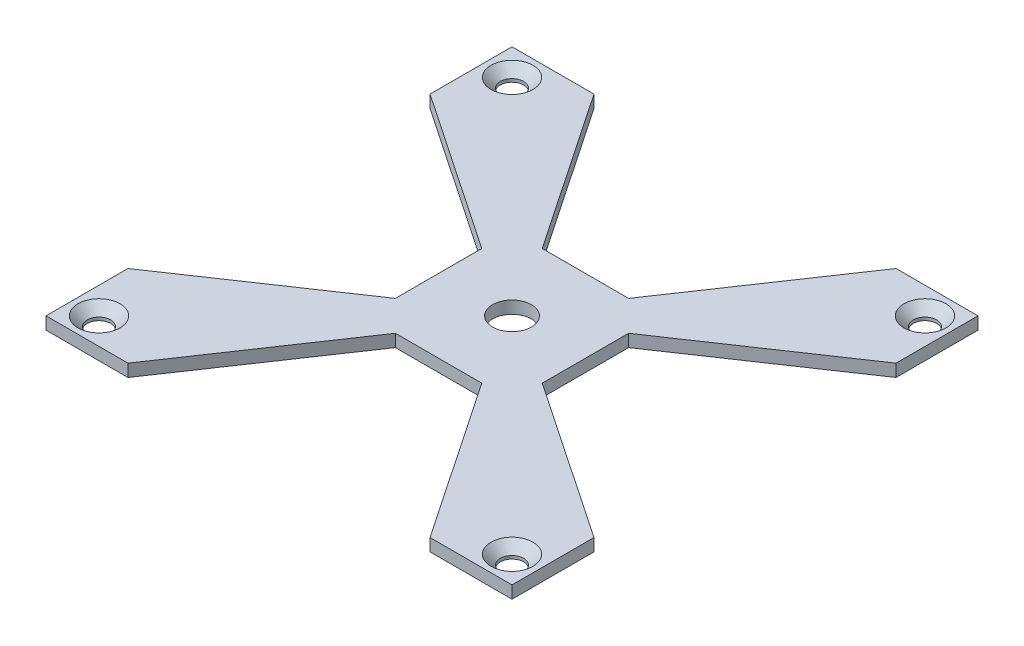
ISO-10303-21;
HEADER;
FILE_DESCRIPTION(('STEP AP214'),'2;1');
FILE_NAME('part.step','',(''),(''),'','','');
FILE_SCHEMA(('AUTOMOTIVE_DESIGN { 1 0 10303 214 1 1 1 1 }'));
ENDSEC;
DATA;
#1=APPLICATION_CONTEXT('core data for automotive mechanical design processes');
#2=APPLICATION_PROTOCOL_DEFINITION('international standard','automotive_design',2000,#1);
#3=PRODUCT_CONTEXT('',#1,'mechanical');
#4=PRODUCT('Part','Part','',(#3));
#5=PRODUCT_RELATED_PRODUCT_CATEGORY('part','',(#4));
#6=PRODUCT_DEFINITION_FORMATION('','',#4);
#7=PRODUCT_DEFINITION_CONTEXT('part definition',#1,'design');
#8=PRODUCT_DEFINITION('design','',#6,#7);
#9=PRODUCT_DEFINITION_SHAPE('','',#8);
#10=(LENGTH_UNIT() NAMED_UNIT(*) SI_UNIT(.MILLI.,.METRE.));
#11=(NAMED_UNIT(*) PLANE_ANGLE_UNIT() SI_UNIT($,.RADIAN.));
#12=(NAMED_UNIT(*) SI_UNIT($,.STERADIAN.) SOLID_ANGLE_UNIT());
#13=UNCERTAINTY_MEASURE_WITH_UNIT(LENGTH_MEASURE(1.E-05),#10,'distance_accuracy_value','');
#14=(GEOMETRIC_REPRESENTATION_CONTEXT(3) GLOBAL_UNCERTAINTY_ASSIGNED_CONTEXT((#13)) GLOBAL_UNIT_ASSIGNED_CONTEXT((#10,
#11,#12)) REPRESENTATION_CONTEXT('',''));
#15=CARTESIAN_POINT('',(0.,0.,0.));
#16=DIRECTION('',(0.,0.,1.));
#17=DIRECTION('',(1.,0.,0.));
#18=AXIS2_PLACEMENT_3D('',#15,#16,#17);
#19=CARTESIAN_POINT('',(47.625,2.54,-47.625));
#20=DIRECTION('',(-1.,0.,0.));
#21=DIRECTION('',(0.,0.,1.));
#22=AXIS2_PLACEMENT_3D('',#19,#20,#21);
#23=PLANE('',#22);
#24=DIRECTION('',(0.,0.,-1.));
#25=VECTOR('',#24,1.);
#26=CARTESIAN_POINT('',(47.625,2.54,-47.625));
#27=LINE('',#26,#25);
#28=CARTESIAN_POINT('',(47.625,2.54,-30.8690323145502));
#29=VERTEX_POINT('',#28);
#30=CARTESIAN_POINT('',(47.625,2.54,-47.625));
#31=VERTEX_POINT('',#30);
#32=EDGE_CURVE('E298',#29,#31,#27,.T.);
#33=ORIENTED_EDGE('',*,*,#32,.F.);
#34=DIRECTION('',(0.,1.,0.));
#35=VECTOR('',#34,1.);
#36=CARTESIAN_POINT('',(47.625,-0.00100000000000013,-30.8690323145502));
#37=LINE('',#36,#35);
#38=CARTESIAN_POINT('',(47.625,0.,-30.8690323145502));
#39=VERTEX_POINT('',#38);
#40=EDGE_CURVE('E220',#39,#29,#37,.T.);
#41=ORIENTED_EDGE('',*,*,#40,.F.);
#42=DIRECTION('',(0.,0.,-1.));
#43=VECTOR('',#42,1.);
#44=CARTESIAN_POINT('',(47.625,0.,-47.625));
#45=LINE('',#44,#43);
#46=CARTESIAN_POINT('',(47.625,0.,-47.625));
#47=VERTEX_POINT('',#46);
#48=EDGE_CURVE('E293',#39,#47,#45,.T.);
#49=ORIENTED_EDGE('',*,*,#48,.T.);
#50=DIRECTION('',(0.,-1.,0.));
#51=VECTOR('',#50,1.);
#52=CARTESIAN_POINT('',(47.625,2.54,-47.625));
#53=LINE('',#52,#51);
#54=EDGE_CURVE('E333',#31,#47,#53,.T.);
#55=ORIENTED_EDGE('',*,*,#54,.F.);
#56=EDGE_LOOP('',(#33,#41,#49,#55));
#57=FACE_BOUND('',#56,.T.);
#58=ADVANCED_FACE('F39',(#57),#23,.F.);
#59=CARTESIAN_POINT('',(-47.625,2.54,-47.625));
#60=DIRECTION('',(0.,0.,1.));
#61=DIRECTION('',(1.,0.,0.));
#62=AXIS2_PLACEMENT_3D('',#59,#60,#61);
#63=PLANE('',#62);
#64=DIRECTION('',(-1.,0.,0.));
#65=VECTOR('',#64,1.);
#66=CARTESIAN_POINT('',(-47.625,2.54,-47.625));
#67=LINE('',#66,#65);
#68=CARTESIAN_POINT('',(-30.8690323145502,2.54,-47.625));
#69=VERTEX_POINT('',#68);
#70=CARTESIAN_POINT('',(-47.625,2.54,-47.625));
#71=VERTEX_POINT('',#70);
#72=EDGE_CURVE('E297',#69,#71,#67,.T.);
#73=ORIENTED_EDGE('',*,*,#72,.F.);
#74=DIRECTION('',(0.,1.,0.));
#75=VECTOR('',#74,1.);
#76=CARTESIAN_POINT('',(-30.8690323145502,-0.00100000000000013,-47.625));
#77=LINE('',#76,#75);
#78=CARTESIAN_POINT('',(-30.8690323145502,0.,-47.625));
#79=VERTEX_POINT('',#78);
#80=EDGE_CURVE('E243',#79,#69,#77,.T.);
#81=ORIENTED_EDGE('',*,*,#80,.F.);
#82=DIRECTION('',(-1.,0.,0.));
#83=VECTOR('',#82,1.);
#84=CARTESIAN_POINT('',(-47.625,0.,-47.625));
#85=LINE('',#84,#83);
#86=CARTESIAN_POINT('',(-47.625,0.,-47.625));
#87=VERTEX_POINT('',#86);
#88=EDGE_CURVE('E314',#79,#87,#85,.T.);
#89=ORIENTED_EDGE('',*,*,#88,.T.);
#90=DIRECTION('',(0.,-1.,0.));
#91=VECTOR('',#90,1.);
#92=CARTESIAN_POINT('',(-47.625,2.54,-47.625));
#93=LINE('',#92,#91);
#94=EDGE_CURVE('E330',#71,#87,#93,.T.);
#95=ORIENTED_EDGE('',*,*,#94,.F.);
#96=EDGE_LOOP('',(#73,#81,#89,#95));
#97=FACE_BOUND('',#96,.T.);
#98=ADVANCED_FACE('F374',(#97),#63,.F.);
#99=CARTESIAN_POINT('',(-47.625,2.54,-47.625));
#100=DIRECTION('',(1.,0.,0.));
#101=DIRECTION('',(0.,0.,-1.));
#102=AXIS2_PLACEMENT_3D('',#99,#100,#101);
#103=PLANE('',#102);
#104=DIRECTION('',(0.,0.,1.));
#105=VECTOR('',#104,1.);
#106=CARTESIAN_POINT('',(-47.625,2.54,-47.625));
#107=LINE('',#106,#105);
#108=CARTESIAN_POINT('',(-47.625,2.54,30.8690323145502));
#109=VERTEX_POINT('',#108);
#110=CARTESIAN_POINT('',(-47.625,2.54,47.625));
#111=VERTEX_POINT('',#110);
#112=EDGE_CURVE('E302',#109,#111,#107,.T.);
#113=ORIENTED_EDGE('',*,*,#112,.F.);
#114=DIRECTION('',(0.,1.,0.));
#115=VECTOR('',#114,1.);
#116=CARTESIAN_POINT('',(-47.625,-0.00100000000000013,30.8690323145502));
#117=LINE('',#116,#115);
#118=CARTESIAN_POINT('',(-47.625,0.,30.8690323145502));
#119=VERTEX_POINT('',#118);
#120=EDGE_CURVE('E269',#119,#109,#117,.T.);
#121=ORIENTED_EDGE('',*,*,#120,.F.);
#122=DIRECTION('',(0.,0.,1.));
#123=VECTOR('',#122,1.);
#124=CARTESIAN_POINT('',(-47.625,0.,-47.625));
#125=LINE('',#124,#123);
#126=CARTESIAN_POINT('',(-47.625,0.,47.625));
#127=VERTEX_POINT('',#126);
#128=EDGE_CURVE('E318',#119,#127,#125,.T.);
#129=ORIENTED_EDGE('',*,*,#128,.T.);
#130=DIRECTION('',(0.,-1.,0.));
#131=VECTOR('',#130,1.);
#132=CARTESIAN_POINT('',(-47.625,2.54,47.625));
#133=LINE('',#132,#131);
#134=EDGE_CURVE('E327',#111,#127,#133,.T.);
#135=ORIENTED_EDGE('',*,*,#134,.F.);
#136=EDGE_LOOP('',(#113,#121,#129,#135));
#137=FACE_BOUND('',#136,.T.);
#138=ADVANCED_FACE('F381',(#137),#103,.F.);
#139=CARTESIAN_POINT('',(-47.625,2.54,47.625));
#140=DIRECTION('',(0.,0.,-1.));
#141=DIRECTION('',(-1.,0.,0.));
#142=AXIS2_PLACEMENT_3D('',#139,#140,#141);
#143=PLANE('',#142);
#144=DIRECTION('',(1.,0.,0.));
#145=VECTOR('',#144,1.);
#146=CARTESIAN_POINT('',(-47.625,2.54,47.625));
#147=LINE('',#146,#145);
#148=CARTESIAN_POINT('',(30.8690323145502,2.54,47.625));
#149=VERTEX_POINT('',#148);
#150=CARTESIAN_POINT('',(47.625,2.54,47.625));
#151=VERTEX_POINT('',#150);
#152=EDGE_CURVE('E306',#149,#151,#147,.T.);
#153=ORIENTED_EDGE('',*,*,#152,.F.);
#154=DIRECTION('',(0.,1.,0.));
#155=VECTOR('',#154,1.);
#156=CARTESIAN_POINT('',(30.8690323145502,-0.00100000000000013,47.625));
#157=LINE('',#156,#155);
#158=CARTESIAN_POINT('',(30.8690323145502,0.,47.625));
#159=VERTEX_POINT('',#158);
#160=EDGE_CURVE('E186',#159,#149,#157,.T.);
#161=ORIENTED_EDGE('',*,*,#160,.F.);
#162=DIRECTION('',(1.,0.,0.));
#163=VECTOR('',#162,1.);
#164=CARTESIAN_POINT('',(-47.625,0.,47.625));
#165=LINE('',#164,#163);
#166=CARTESIAN_POINT('',(47.625,0.,47.625));
#167=VERTEX_POINT('',#166);
#168=EDGE_CURVE('E204',#159,#167,#165,.T.);
#169=ORIENTED_EDGE('',*,*,#168,.T.);
#170=DIRECTION('',(0.,-1.,0.));
#171=VECTOR('',#170,1.);
#172=CARTESIAN_POINT('',(47.625,2.54,47.625));
#173=LINE('',#172,#171);
#174=EDGE_CURVE('E310',#151,#167,#173,.T.);
#175=ORIENTED_EDGE('',*,*,#174,.F.);
#176=EDGE_LOOP('',(#153,#161,#169,#175));
#177=FACE_BOUND('',#176,.T.);
#178=ADVANCED_FACE('F395',(#177),#143,.F.);
#179=CARTESIAN_POINT('',(0.,0.,0.));
#180=DIRECTION('',(0.,1.,0.));
#181=DIRECTION('',(0.,0.,1.));
#182=AXIS2_PLACEMENT_3D('',#179,#180,#181);
#183=PLANE('',#182);
#184=CARTESIAN_POINT('',(0.,0.,0.));
#185=DIRECTION('',(0.,1.,0.));
#186=DIRECTION('',(0.,0.,1.));
#187=AXIS2_PLACEMENT_3D('',#184,#185,#186);
#188=CIRCLE('',#187,3.96875);
#189=CARTESIAN_POINT('',(0.,0.,3.96875));
#190=VERTEX_POINT('',#189);
#191=EDGE_CURVE('E432',#190,#190,#188,.T.);
#192=ORIENTED_EDGE('',*,*,#191,.T.);
#193=EDGE_LOOP('',(#192));
#194=FACE_BOUND('',#193,.T.);
#195=ORIENTED_EDGE('',*,*,#48,.F.);
#196=DIRECTION('',(0.82860616665165,0.,-0.559831957454072));
#197=VECTOR('',#196,1.);
#198=CARTESIAN_POINT('',(15.0062723280695,0.,-8.83081090469776));
#199=LINE('',#198,#197);
#200=CARTESIAN_POINT('',(15.0062723280695,0.,-8.83081090469776));
#201=VERTEX_POINT('',#200);
#202=EDGE_CURVE('E228',#201,#39,#199,.T.);
#203=ORIENTED_EDGE('',*,*,#202,.F.);
#204=DIRECTION('',(0.,0.,-1.));
#205=VECTOR('',#204,1.);
#206=CARTESIAN_POINT('',(15.0062723280695,0.,8.83081090469777));
#207=LINE('',#206,#205);
#208=CARTESIAN_POINT('',(15.0062723280695,0.,8.83081090469777));
#209=VERTEX_POINT('',#208);
#210=EDGE_CURVE('E230',#209,#201,#207,.T.);
#211=ORIENTED_EDGE('',*,*,#210,.F.);
#212=DIRECTION('',(-0.828606166651651,0.,-0.559831957454072));
#213=VECTOR('',#212,1.);
#214=CARTESIAN_POINT('',(15.0062723280695,0.,8.83081090469777));
#215=LINE('',#214,#213);
#216=CARTESIAN_POINT('',(47.625,0.,30.8690323145502));
#217=VERTEX_POINT('',#216);
#218=EDGE_CURVE('E197',#217,#209,#215,.T.);
#219=ORIENTED_EDGE('',*,*,#218,.F.);
#220=EDGE_CURVE('E311',#167,#217,#45,.T.);
#221=ORIENTED_EDGE('',*,*,#220,.F.);
#222=ORIENTED_EDGE('',*,*,#168,.F.);
#223=DIRECTION('',(0.559831957454072,0.,0.82860616665165));
#224=VECTOR('',#223,1.);
#225=CARTESIAN_POINT('',(8.83081090469776,0.,15.0062723280695));
#226=LINE('',#225,#224);
#227=CARTESIAN_POINT('',(8.83081090469776,0.,15.0062723280695));
#228=VERTEX_POINT('',#227);
#229=EDGE_CURVE('E180',#228,#159,#226,.T.);
#230=ORIENTED_EDGE('',*,*,#229,.F.);
#231=DIRECTION('',(1.,0.,0.));
#232=VECTOR('',#231,1.);
#233=CARTESIAN_POINT('',(-8.83081090469777,0.,15.0062723280695));
#234=LINE('',#233,#232);
#235=CARTESIAN_POINT('',(-8.83081090469777,0.,15.0062723280695));
#236=VERTEX_POINT('',#235);
#237=EDGE_CURVE('E190',#236,#228,#234,.T.);
#238=ORIENTED_EDGE('',*,*,#237,.F.);
#239=DIRECTION('',(0.559831957454072,0.,-0.828606166651651));
#240=VECTOR('',#239,1.);
#241=CARTESIAN_POINT('',(-8.83081090469777,0.,15.0062723280695));
#242=LINE('',#241,#240);
#243=CARTESIAN_POINT('',(-30.8690323145502,0.,47.625));
#244=VERTEX_POINT('',#243);
#245=EDGE_CURVE('E187',#244,#236,#242,.T.);
#246=ORIENTED_EDGE('',*,*,#245,.F.);
#247=EDGE_CURVE('E322',#127,#244,#165,.T.);
#248=ORIENTED_EDGE('',*,*,#247,.F.);
#249=ORIENTED_EDGE('',*,*,#128,.F.);
#250=DIRECTION('',(-0.82860616665165,0.,0.559831957454072));
#251=VECTOR('',#250,1.);
#252=CARTESIAN_POINT('',(-15.0062723280695,0.,8.83081090469776));
#253=LINE('',#252,#251);
#254=CARTESIAN_POINT('',(-15.0062723280695,0.,8.83081090469775));
#255=VERTEX_POINT('',#254);
#256=EDGE_CURVE('E259',#255,#119,#253,.T.);
#257=ORIENTED_EDGE('',*,*,#256,.F.);
#258=DIRECTION('',(0.,0.,1.));
#259=VECTOR('',#258,1.);
#260=CARTESIAN_POINT('',(-15.0062723280695,0.,-8.83081090469777));
#261=LINE('',#260,#259);
#262=CARTESIAN_POINT('',(-15.0062723280695,0.,-8.83081090469777));
#263=VERTEX_POINT('',#262);
#264=EDGE_CURVE('E271',#263,#255,#261,.T.);
#265=ORIENTED_EDGE('',*,*,#264,.F.);
#266=DIRECTION('',(0.82860616665165,0.,0.559831957454072));
#267=VECTOR('',#266,1.);
#268=CARTESIAN_POINT('',(-15.0062723280695,0.,-8.83081090469777));
#269=LINE('',#268,#267);
#270=CARTESIAN_POINT('',(-47.625,0.,-30.8690323145502));
#271=VERTEX_POINT('',#270);
#272=EDGE_CURVE('E256',#271,#263,#269,.T.);
#273=ORIENTED_EDGE('',*,*,#272,.F.);
#274=EDGE_CURVE('E319',#87,#271,#125,.T.);
#275=ORIENTED_EDGE('',*,*,#274,.F.);
#276=ORIENTED_EDGE('',*,*,#88,.F.);
#277=DIRECTION('',(-0.559831957454072,0.,-0.82860616665165));
#278=VECTOR('',#277,1.);
#279=CARTESIAN_POINT('',(-8.83081090469776,0.,-15.0062723280695));
#280=LINE('',#279,#278);
#281=CARTESIAN_POINT('',(-8.83081090469776,0.,-15.0062723280695));
#282=VERTEX_POINT('',#281);
#283=EDGE_CURVE('E251',#282,#79,#280,.T.);
#284=ORIENTED_EDGE('',*,*,#283,.F.);
#285=DIRECTION('',(-1.,0.,0.));
#286=VECTOR('',#285,1.);
#287=CARTESIAN_POINT('',(8.83081090469777,0.,-15.0062723280695));
#288=LINE('',#287,#286);
#289=CARTESIAN_POINT('',(8.83081090469777,0.,-15.0062723280695));
#290=VERTEX_POINT('',#289);
#291=EDGE_CURVE('E253',#290,#282,#288,.T.);
#292=ORIENTED_EDGE('',*,*,#291,.F.);
#293=DIRECTION('',(-0.559831957454072,0.,0.82860616665165));
#294=VECTOR('',#293,1.);
#295=CARTESIAN_POINT('',(8.83081090469777,0.,-15.0062723280695));
#296=LINE('',#295,#294);
#297=CARTESIAN_POINT('',(30.8690323145502,0.,-47.625));
#298=VERTEX_POINT('',#297);
#299=EDGE_CURVE('E233',#298,#290,#296,.T.);
#300=ORIENTED_EDGE('',*,*,#299,.F.);
#301=EDGE_CURVE('E315',#47,#298,#85,.T.);
#302=ORIENTED_EDGE('',*,*,#301,.F.);
#303=EDGE_LOOP('',(#195,#203,#211,#219,#221,#222,#230,#238,#246,#248,#249,#257,#265,#273,#275,
#276,#284,#292,#300,#302));
#304=FACE_BOUND('',#303,.T.);
#305=CARTESIAN_POINT('',(-42.207203769025,0.,42.207203769025));
#306=DIRECTION('',(0.,1.,0.));
#307=DIRECTION('',(0.,0.,1.));
#308=AXIS2_PLACEMENT_3D('',#305,#306,#307);
#309=CIRCLE('',#308,2.38125);
#310=CARTESIAN_POINT('',(-42.207203769025,0.,44.588453769025));
#311=VERTEX_POINT('',#310);
#312=EDGE_CURVE('E290',#311,#311,#309,.F.);
#313=ORIENTED_EDGE('',*,*,#312,.F.);
#314=EDGE_LOOP('',(#313));
#315=FACE_BOUND('',#314,.T.);
#316=CARTESIAN_POINT('',(42.207203769025,0.,42.207203769025));
#317=DIRECTION('',(0.,1.,0.));
#318=DIRECTION('',(0.,0.,1.));
#319=AXIS2_PLACEMENT_3D('',#316,#317,#318);
#320=CIRCLE('',#319,2.38125);
#321=CARTESIAN_POINT('',(42.207203769025,0.,44.588453769025));
#322=VERTEX_POINT('',#321);
#323=EDGE_CURVE('E287',#322,#322,#320,.F.);
#324=ORIENTED_EDGE('',*,*,#323,.F.);
#325=EDGE_LOOP('',(#324));
#326=FACE_BOUND('',#325,.T.);
#327=CARTESIAN_POINT('',(42.207203769025,0.,-42.207203769025));
#328=DIRECTION('',(0.,1.,0.));
#329=DIRECTION('',(0.,0.,1.));
#330=AXIS2_PLACEMENT_3D('',#327,#328,#329);
#331=CIRCLE('',#330,2.38125);
#332=CARTESIAN_POINT('',(42.207203769025,0.,-39.825953769025));
#333=VERTEX_POINT('',#332);
#334=EDGE_CURVE('E284',#333,#333,#331,.F.);
#335=ORIENTED_EDGE('',*,*,#334,.F.);
#336=EDGE_LOOP('',(#335));
#337=FACE_BOUND('',#336,.T.);
#338=CARTESIAN_POINT('',(-42.207203769025,0.,-42.207203769025));
#339=DIRECTION('',(0.,1.,0.));
#340=DIRECTION('',(0.,0.,1.));
#341=AXIS2_PLACEMENT_3D('',#338,#339,#340);
#342=CIRCLE('',#341,2.38125);
#343=CARTESIAN_POINT('',(-42.207203769025,0.,-39.825953769025));
#344=VERTEX_POINT('',#343);
#345=EDGE_CURVE('E281',#344,#344,#342,.F.);
#346=ORIENTED_EDGE('',*,*,#345,.F.);
#347=EDGE_LOOP('',(#346));
#348=FACE_BOUND('',#347,.T.);
#349=ADVANCED_FACE('F201',(#194,#304,#315,#326,#337,#348),#183,.F.);
#350=ORIENTED_EDGE('',*,*,#220,.T.);
#351=DIRECTION('',(0.,1.,0.));
#352=VECTOR('',#351,1.);
#353=CARTESIAN_POINT('',(47.625,-0.00100000000000013,30.8690323145502));
#354=LINE('',#353,#352);
#355=CARTESIAN_POINT('',(47.625,2.54,30.8690323145502));
#356=VERTEX_POINT('',#355);
#357=EDGE_CURVE('E217',#217,#356,#354,.T.);
#358=ORIENTED_EDGE('',*,*,#357,.T.);
#359=EDGE_CURVE('E294',#151,#356,#27,.T.);
#360=ORIENTED_EDGE('',*,*,#359,.F.);
#361=ORIENTED_EDGE('',*,*,#174,.T.);
#362=EDGE_LOOP('',(#350,#358,#360,#361));
#363=FACE_BOUND('',#362,.T.);
#364=ADVANCED_FACE('F377',(#363),#23,.F.);
#365=ORIENTED_EDGE('',*,*,#301,.T.);
#366=DIRECTION('',(0.,1.,0.));
#367=VECTOR('',#366,1.);
#368=CARTESIAN_POINT('',(30.8690323145502,-0.00100000000000013,-47.625));
#369=LINE('',#368,#367);
#370=CARTESIAN_POINT('',(30.8690323145502,2.54,-47.625));
#371=VERTEX_POINT('',#370);
#372=EDGE_CURVE('E240',#298,#371,#369,.T.);
#373=ORIENTED_EDGE('',*,*,#372,.T.);
#374=EDGE_CURVE('E299',#31,#371,#67,.T.);
#375=ORIENTED_EDGE('',*,*,#374,.F.);
#376=ORIENTED_EDGE('',*,*,#54,.T.);
#377=EDGE_LOOP('',(#365,#373,#375,#376));
#378=FACE_BOUND('',#377,.T.);
#379=ADVANCED_FACE('F384',(#378),#63,.F.);
#380=ORIENTED_EDGE('',*,*,#274,.T.);
#381=DIRECTION('',(0.,1.,0.));
#382=VECTOR('',#381,1.);
#383=CARTESIAN_POINT('',(-47.625,-0.00100000000000013,-30.8690323145502));
#384=LINE('',#383,#382);
#385=CARTESIAN_POINT('',(-47.625,2.54,-30.8690323145502));
#386=VERTEX_POINT('',#385);
#387=EDGE_CURVE('E272',#271,#386,#384,.T.);
#388=ORIENTED_EDGE('',*,*,#387,.T.);
#389=EDGE_CURVE('E303',#71,#386,#107,.T.);
#390=ORIENTED_EDGE('',*,*,#389,.F.);
#391=ORIENTED_EDGE('',*,*,#94,.T.);
#392=EDGE_LOOP('',(#380,#388,#390,#391));
#393=FACE_BOUND('',#392,.T.);
#394=ADVANCED_FACE('F393',(#393),#103,.F.);
#395=ORIENTED_EDGE('',*,*,#247,.T.);
#396=DIRECTION('',(0.,1.,0.));
#397=VECTOR('',#396,1.);
#398=CARTESIAN_POINT('',(-30.8690323145502,-0.00100000000000013,47.625));
#399=LINE('',#398,#397);
#400=CARTESIAN_POINT('',(-30.8690323145502,2.54,47.625));
#401=VERTEX_POINT('',#400);
#402=EDGE_CURVE('E411',#244,#401,#399,.T.);
#403=ORIENTED_EDGE('',*,*,#402,.T.);
#404=EDGE_CURVE('E307',#111,#401,#147,.T.);
#405=ORIENTED_EDGE('',*,*,#404,.F.);
#406=ORIENTED_EDGE('',*,*,#134,.T.);
#407=EDGE_LOOP('',(#395,#403,#405,#406));
#408=FACE_BOUND('',#407,.T.);
#409=ADVANCED_FACE('F422',(#408),#143,.F.);
#410=CARTESIAN_POINT('',(0.,2.54,0.));
#411=DIRECTION('',(0.,1.,0.));
#412=DIRECTION('',(0.,0.,1.));
#413=AXIS2_PLACEMENT_3D('',#410,#411,#412);
#414=PLANE('',#413);
#415=CARTESIAN_POINT('',(-42.207203769025,2.54,42.207203769025));
#416=DIRECTION('',(0.,1.,0.));
#417=DIRECTION('',(0.,0.,1.));
#418=AXIS2_PLACEMENT_3D('',#415,#416,#417);
#419=CIRCLE('',#418,4.28624999999999);
#420=CARTESIAN_POINT('',(-42.207203769025,2.54,46.493453769025));
#421=VERTEX_POINT('',#420);
#422=EDGE_CURVE('E348',#421,#421,#419,.F.);
#423=ORIENTED_EDGE('',*,*,#422,.T.);
#424=EDGE_LOOP('',(#423));
#425=FACE_BOUND('',#424,.T.);
#426=CARTESIAN_POINT('',(42.207203769025,2.54,42.207203769025));
#427=DIRECTION('',(0.,1.,0.));
#428=DIRECTION('',(0.,0.,1.));
#429=AXIS2_PLACEMENT_3D('',#426,#427,#428);
#430=CIRCLE('',#429,4.28624999999999);
#431=CARTESIAN_POINT('',(42.207203769025,2.54,46.493453769025));
#432=VERTEX_POINT('',#431);
#433=EDGE_CURVE('E345',#432,#432,#430,.F.);
#434=ORIENTED_EDGE('',*,*,#433,.T.);
#435=EDGE_LOOP('',(#434));
#436=FACE_BOUND('',#435,.T.);
#437=CARTESIAN_POINT('',(42.207203769025,2.54,-42.207203769025));
#438=DIRECTION('',(0.,1.,0.));
#439=DIRECTION('',(0.,0.,1.));
#440=AXIS2_PLACEMENT_3D('',#437,#438,#439);
#441=CIRCLE('',#440,4.28624999999999);
#442=CARTESIAN_POINT('',(42.207203769025,2.54,-37.920953769025));
#443=VERTEX_POINT('',#442);
#444=EDGE_CURVE('E342',#443,#443,#441,.F.);
#445=ORIENTED_EDGE('',*,*,#444,.T.);
#446=EDGE_LOOP('',(#445));
#447=FACE_BOUND('',#446,.T.);
#448=CARTESIAN_POINT('',(-42.207203769025,2.54,-42.207203769025));
#449=DIRECTION('',(0.,1.,0.));
#450=DIRECTION('',(0.,0.,1.));
#451=AXIS2_PLACEMENT_3D('',#448,#449,#450);
#452=CIRCLE('',#451,4.28624999999999);
#453=CARTESIAN_POINT('',(-42.207203769025,2.54,-37.920953769025));
#454=VERTEX_POINT('',#453);
#455=EDGE_CURVE('E339',#454,#454,#452,.F.);
#456=ORIENTED_EDGE('',*,*,#455,.T.);
#457=EDGE_LOOP('',(#456));
#458=FACE_BOUND('',#457,.T.);
#459=CARTESIAN_POINT('',(0.,2.54,0.));
#460=DIRECTION('',(0.,1.,0.));
#461=DIRECTION('',(0.,0.,1.));
#462=AXIS2_PLACEMENT_3D('',#459,#460,#461);
#463=CIRCLE('',#462,3.96875);
#464=CARTESIAN_POINT('',(0.,2.54,3.96875));
#465=VERTEX_POINT('',#464);
#466=EDGE_CURVE('E435',#465,#465,#463,.T.);
#467=ORIENTED_EDGE('',*,*,#466,.F.);
#468=EDGE_LOOP('',(#467));
#469=FACE_BOUND('',#468,.T.);
#470=DIRECTION('',(-0.82860616665165,0.,0.559831957454072));
#471=VECTOR('',#470,1.);
#472=CARTESIAN_POINT('',(15.0062723280695,2.54,-8.83081090469776));
#473=LINE('',#472,#471);
#474=CARTESIAN_POINT('',(15.0062723280695,2.54,-8.83081090469776));
#475=VERTEX_POINT('',#474);
#476=EDGE_CURVE('E216',#29,#475,#473,.T.);
#477=ORIENTED_EDGE('',*,*,#476,.F.);
#478=ORIENTED_EDGE('',*,*,#32,.T.);
#479=ORIENTED_EDGE('',*,*,#374,.T.);
#480=DIRECTION('',(0.559831957454072,0.,-0.82860616665165));
#481=VECTOR('',#480,1.);
#482=CARTESIAN_POINT('',(8.83081090469777,2.54,-15.0062723280695));
#483=LINE('',#482,#481);
#484=CARTESIAN_POINT('',(8.83081090469777,2.54,-15.0062723280695));
#485=VERTEX_POINT('',#484);
#486=EDGE_CURVE('E248',#485,#371,#483,.T.);
#487=ORIENTED_EDGE('',*,*,#486,.F.);
#488=DIRECTION('',(1.,0.,0.));
#489=VECTOR('',#488,1.);
#490=CARTESIAN_POINT('',(8.83081090469777,2.54,-15.0062723280695));
#491=LINE('',#490,#489);
#492=CARTESIAN_POINT('',(-8.83081090469776,2.54,-15.0062723280695));
#493=VERTEX_POINT('',#492);
#494=EDGE_CURVE('E63',#493,#485,#491,.T.);
#495=ORIENTED_EDGE('',*,*,#494,.F.);
#496=DIRECTION('',(0.559831957454072,0.,0.82860616665165));
#497=VECTOR('',#496,1.);
#498=CARTESIAN_POINT('',(-8.83081090469776,2.54,-15.0062723280695));
#499=LINE('',#498,#497);
#500=EDGE_CURVE('E239',#69,#493,#499,.T.);
#501=ORIENTED_EDGE('',*,*,#500,.F.);
#502=ORIENTED_EDGE('',*,*,#72,.T.);
#503=ORIENTED_EDGE('',*,*,#389,.T.);
#504=DIRECTION('',(-0.82860616665165,0.,-0.559831957454072));
#505=VECTOR('',#504,1.);
#506=CARTESIAN_POINT('',(-15.0062723280695,2.54,-8.83081090469777));
#507=LINE('',#506,#505);
#508=CARTESIAN_POINT('',(-15.0062723280695,2.54,-8.83081090469777));
#509=VERTEX_POINT('',#508);
#510=EDGE_CURVE('E266',#509,#386,#507,.T.);
#511=ORIENTED_EDGE('',*,*,#510,.F.);
#512=DIRECTION('',(0.,0.,-1.));
#513=VECTOR('',#512,1.);
#514=CARTESIAN_POINT('',(-15.0062723280695,2.54,-8.83081090469777));
#515=LINE('',#514,#513);
#516=CARTESIAN_POINT('',(-15.0062723280695,2.54,8.83081090469776));
#517=VERTEX_POINT('',#516);
#518=EDGE_CURVE('E263',#517,#509,#515,.T.);
#519=ORIENTED_EDGE('',*,*,#518,.F.);
#520=DIRECTION('',(0.82860616665165,0.,-0.559831957454072));
#521=VECTOR('',#520,1.);
#522=CARTESIAN_POINT('',(-15.0062723280695,2.54,8.83081090469776));
#523=LINE('',#522,#521);
#524=EDGE_CURVE('E261',#109,#517,#523,.T.);
#525=ORIENTED_EDGE('',*,*,#524,.F.);
#526=ORIENTED_EDGE('',*,*,#112,.T.);
#527=ORIENTED_EDGE('',*,*,#404,.T.);
#528=DIRECTION('',(-0.559831957454071,0.,0.82860616665165));
#529=VECTOR('',#528,1.);
#530=CARTESIAN_POINT('',(-8.83081090469777,2.54,15.0062723280695));
#531=LINE('',#530,#529);
#532=CARTESIAN_POINT('',(-8.83081090469777,2.54,15.0062723280695));
#533=VERTEX_POINT('',#532);
#534=EDGE_CURVE('E207',#533,#401,#531,.T.);
#535=ORIENTED_EDGE('',*,*,#534,.F.);
#536=DIRECTION('',(-1.,0.,0.));
#537=VECTOR('',#536,1.);
#538=CARTESIAN_POINT('',(-8.83081090469777,2.54,15.0062723280695));
#539=LINE('',#538,#537);
#540=CARTESIAN_POINT('',(8.83081090469776,2.54,15.0062723280695));
#541=VERTEX_POINT('',#540);
#542=EDGE_CURVE('E205',#541,#533,#539,.T.);
#543=ORIENTED_EDGE('',*,*,#542,.F.);
#544=DIRECTION('',(-0.559831957454072,0.,-0.82860616665165));
#545=VECTOR('',#544,1.);
#546=CARTESIAN_POINT('',(8.83081090469776,2.54,15.0062723280695));
#547=LINE('',#546,#545);
#548=EDGE_CURVE('E183',#149,#541,#547,.T.);
#549=ORIENTED_EDGE('',*,*,#548,.F.);
#550=ORIENTED_EDGE('',*,*,#152,.T.);
#551=ORIENTED_EDGE('',*,*,#359,.T.);
#552=DIRECTION('',(0.82860616665165,0.,0.559831957454071));
#553=VECTOR('',#552,1.);
#554=CARTESIAN_POINT('',(15.0062723280695,2.54,8.83081090469777));
#555=LINE('',#554,#553);
#556=CARTESIAN_POINT('',(15.0062723280695,2.54,8.83081090469777));
#557=VERTEX_POINT('',#556);
#558=EDGE_CURVE('E225',#557,#356,#555,.T.);
#559=ORIENTED_EDGE('',*,*,#558,.F.);
#560=DIRECTION('',(0.,0.,1.));
#561=VECTOR('',#560,1.);
#562=CARTESIAN_POINT('',(15.0062723280695,2.54,8.83081090469777));
#563=LINE('',#562,#561);
#564=EDGE_CURVE('E55',#475,#557,#563,.T.);
#565=ORIENTED_EDGE('',*,*,#564,.F.);
#566=EDGE_LOOP('',(#477,#478,#479,#487,#495,#501,#502,#503,#511,#519,#525,#526,#527,#535,#543,
#549,#550,#551,#559,#565));
#567=FACE_BOUND('',#566,.T.);
#568=ADVANCED_FACE('F408',(#425,#436,#447,#458,#469,#567),#414,.T.);
#569=CARTESIAN_POINT('',(-42.207203769025,2.54,42.207203769025));
#570=DIRECTION('',(0.,1.,0.));
#571=DIRECTION('',(0.,0.,1.));
#572=AXIS2_PLACEMENT_3D('',#569,#570,#571);
#573=CYLINDRICAL_SURFACE('',#572,2.38125);
#574=CARTESIAN_POINT('',(-42.207203769025,0.635000000000016,42.207203769025));
#575=DIRECTION('',(0.,1.,0.));
#576=DIRECTION('',(0.,0.,1.));
#577=AXIS2_PLACEMENT_3D('',#574,#575,#576);
#578=CIRCLE('',#577,2.38125);
#579=CARTESIAN_POINT('',(-42.207203769025,0.635000000000016,44.588453769025));
#580=VERTEX_POINT('',#579);
#581=EDGE_CURVE('E336',#580,#580,#578,.T.);
#582=ORIENTED_EDGE('',*,*,#581,.T.);
#583=EDGE_LOOP('',(#582));
#584=FACE_BOUND('',#583,.T.);
#585=ORIENTED_EDGE('',*,*,#312,.T.);
#586=EDGE_LOOP('',(#585));
#587=FACE_BOUND('',#586,.T.);
#588=ADVANCED_FACE('F444',(#584,#587),#573,.F.);
#589=CARTESIAN_POINT('',(42.207203769025,2.54,42.207203769025));
#590=DIRECTION('',(0.,1.,0.));
#591=DIRECTION('',(0.,0.,1.));
#592=AXIS2_PLACEMENT_3D('',#589,#590,#591);
#593=CYLINDRICAL_SURFACE('',#592,2.38125);
#594=CARTESIAN_POINT('',(42.207203769025,0.635000000000016,42.207203769025));
#595=DIRECTION('',(0.,1.,0.));
#596=DIRECTION('',(0.,0.,1.));
#597=AXIS2_PLACEMENT_3D('',#594,#595,#596);
#598=CIRCLE('',#597,2.38125);
#599=CARTESIAN_POINT('',(42.207203769025,0.635000000000016,44.588453769025));
#600=VERTEX_POINT('',#599);
#601=EDGE_CURVE('E351',#600,#600,#598,.T.);
#602=ORIENTED_EDGE('',*,*,#601,.T.);
#603=EDGE_LOOP('',(#602));
#604=FACE_BOUND('',#603,.T.);
#605=ORIENTED_EDGE('',*,*,#323,.T.);
#606=EDGE_LOOP('',(#605));
#607=FACE_BOUND('',#606,.T.);
#608=ADVANCED_FACE('F451',(#604,#607),#593,.F.);
#609=CARTESIAN_POINT('',(42.207203769025,2.54,-42.207203769025));
#610=DIRECTION('',(0.,1.,0.));
#611=DIRECTION('',(0.,0.,1.));
#612=AXIS2_PLACEMENT_3D('',#609,#610,#611);
#613=CYLINDRICAL_SURFACE('',#612,2.38125);
#614=CARTESIAN_POINT('',(42.207203769025,0.635000000000016,-42.207203769025));
#615=DIRECTION('',(0.,1.,0.));
#616=DIRECTION('',(0.,0.,1.));
#617=AXIS2_PLACEMENT_3D('',#614,#615,#616);
#618=CIRCLE('',#617,2.38125);
#619=CARTESIAN_POINT('',(42.207203769025,0.635000000000016,-39.825953769025));
#620=VERTEX_POINT('',#619);
#621=EDGE_CURVE('E48',#620,#620,#618,.T.);
#622=ORIENTED_EDGE('',*,*,#621,.T.);
#623=EDGE_LOOP('',(#622));
#624=FACE_BOUND('',#623,.T.);
#625=ORIENTED_EDGE('',*,*,#334,.T.);
#626=EDGE_LOOP('',(#625));
#627=FACE_BOUND('',#626,.T.);
#628=ADVANCED_FACE('F356',(#624,#627),#613,.F.);
#629=CARTESIAN_POINT('',(-42.207203769025,2.54,-42.207203769025));
#630=DIRECTION('',(0.,1.,0.));
#631=DIRECTION('',(0.,0.,1.));
#632=AXIS2_PLACEMENT_3D('',#629,#630,#631);
#633=CYLINDRICAL_SURFACE('',#632,2.38125);
#634=CARTESIAN_POINT('',(-42.207203769025,0.635000000000016,-42.207203769025));
#635=DIRECTION('',(0.,1.,0.));
#636=DIRECTION('',(0.,0.,1.));
#637=AXIS2_PLACEMENT_3D('',#634,#635,#636);
#638=CIRCLE('',#637,2.38125);
#639=CARTESIAN_POINT('',(-42.207203769025,0.635000000000016,-39.825953769025));
#640=VERTEX_POINT('',#639);
#641=EDGE_CURVE('E11',#640,#640,#638,.T.);
#642=ORIENTED_EDGE('',*,*,#641,.T.);
#643=EDGE_LOOP('',(#642));
#644=FACE_BOUND('',#643,.T.);
#645=ORIENTED_EDGE('',*,*,#345,.T.);
#646=EDGE_LOOP('',(#645));
#647=FACE_BOUND('',#646,.T.);
#648=ADVANCED_FACE('F631',(#644,#647),#633,.F.);
#649=CARTESIAN_POINT('',(-15.0062723280695,-0.00100000000000013,8.83081090469776));
#650=DIRECTION('',(0.559831957454072,0.,0.82860616665165));
#651=DIRECTION('',(0.82860616665165,0.,-0.559831957454072));
#652=AXIS2_PLACEMENT_3D('',#649,#650,#651);
#653=PLANE('',#652);
#654=ORIENTED_EDGE('',*,*,#256,.T.);
#655=ORIENTED_EDGE('',*,*,#120,.T.);
#656=ORIENTED_EDGE('',*,*,#524,.T.);
#657=DIRECTION('',(0.,1.,0.));
#658=VECTOR('',#657,1.);
#659=CARTESIAN_POINT('',(-15.0062723280695,-0.00100000000000013,8.83081090469776));
#660=LINE('',#659,#658);
#661=EDGE_CURVE('E268',#255,#517,#660,.T.);
#662=ORIENTED_EDGE('',*,*,#661,.F.);
#663=EDGE_LOOP('',(#654,#655,#656,#662));
#664=FACE_BOUND('',#663,.T.);
#665=ADVANCED_FACE('F621',(#664),#653,.F.);
#666=CARTESIAN_POINT('',(-15.0062723280695,-0.00100000000000013,-8.83081090469777));
#667=DIRECTION('',(0.559831957454072,0.,-0.82860616665165));
#668=DIRECTION('',(-0.82860616665165,0.,-0.559831957454072));
#669=AXIS2_PLACEMENT_3D('',#666,#667,#668);
#670=PLANE('',#669);
#671=ORIENTED_EDGE('',*,*,#272,.T.);
#672=DIRECTION('',(0.,1.,0.));
#673=VECTOR('',#672,1.);
#674=CARTESIAN_POINT('',(-15.0062723280695,-0.00100000000000013,-8.83081090469777));
#675=LINE('',#674,#673);
#676=EDGE_CURVE('E275',#263,#509,#675,.T.);
#677=ORIENTED_EDGE('',*,*,#676,.T.);
#678=ORIENTED_EDGE('',*,*,#510,.T.);
#679=ORIENTED_EDGE('',*,*,#387,.F.);
#680=EDGE_LOOP('',(#671,#677,#678,#679));
#681=FACE_BOUND('',#680,.T.);
#682=ADVANCED_FACE('F611',(#681),#670,.F.);
#683=CARTESIAN_POINT('',(-15.0062723280695,-0.00100000000000013,-8.83081090469777));
#684=DIRECTION('',(1.,0.,0.));
#685=DIRECTION('',(0.,0.,-1.));
#686=AXIS2_PLACEMENT_3D('',#683,#684,#685);
#687=PLANE('',#686);
#688=ORIENTED_EDGE('',*,*,#264,.T.);
#689=ORIENTED_EDGE('',*,*,#661,.T.);
#690=ORIENTED_EDGE('',*,*,#518,.T.);
#691=ORIENTED_EDGE('',*,*,#676,.F.);
#692=EDGE_LOOP('',(#688,#689,#690,#691));
#693=FACE_BOUND('',#692,.T.);
#694=ADVANCED_FACE('F602',(#693),#687,.F.);
#695=CARTESIAN_POINT('',(-8.83081090469777,-0.00100000000000013,15.0062723280695));
#696=DIRECTION('',(0.,0.,-1.));
#697=DIRECTION('',(-1.,0.,0.));
#698=AXIS2_PLACEMENT_3D('',#695,#696,#697);
#699=PLANE('',#698);
#700=ORIENTED_EDGE('',*,*,#237,.T.);
#701=DIRECTION('',(0.,1.,0.));
#702=VECTOR('',#701,1.);
#703=CARTESIAN_POINT('',(8.83081090469776,-0.00100000000000013,15.0062723280695));
#704=LINE('',#703,#702);
#705=EDGE_CURVE('E176',#228,#541,#704,.T.);
#706=ORIENTED_EDGE('',*,*,#705,.T.);
#707=ORIENTED_EDGE('',*,*,#542,.T.);
#708=DIRECTION('',(0.,1.,0.));
#709=VECTOR('',#708,1.);
#710=CARTESIAN_POINT('',(-8.83081090469777,-0.00100000000000013,15.0062723280695));
#711=LINE('',#710,#709);
#712=EDGE_CURVE('E193',#236,#533,#711,.T.);
#713=ORIENTED_EDGE('',*,*,#712,.F.);
#714=EDGE_LOOP('',(#700,#706,#707,#713));
#715=FACE_BOUND('',#714,.T.);
#716=ADVANCED_FACE('F191',(#715),#699,.F.);
#717=CARTESIAN_POINT('',(8.83081090469776,-0.00100000000000013,15.0062723280695));
#718=DIRECTION('',(0.82860616665165,0.,-0.559831957454072));
#719=DIRECTION('',(-0.559831957454072,0.,-0.82860616665165));
#720=AXIS2_PLACEMENT_3D('',#717,#718,#719);
#721=PLANE('',#720);
#722=ORIENTED_EDGE('',*,*,#229,.T.);
#723=ORIENTED_EDGE('',*,*,#160,.T.);
#724=ORIENTED_EDGE('',*,*,#548,.T.);
#725=ORIENTED_EDGE('',*,*,#705,.F.);
#726=EDGE_LOOP('',(#722,#723,#724,#725));
#727=FACE_BOUND('',#726,.T.);
#728=ADVANCED_FACE('F178',(#727),#721,.F.);
#729=CARTESIAN_POINT('',(-8.83081090469777,-0.00100000000000013,15.0062723280695));
#730=DIRECTION('',(-0.828606166651651,0.,-0.559831957454072));
#731=DIRECTION('',(-0.559831957454072,0.,0.828606166651651));
#732=AXIS2_PLACEMENT_3D('',#729,#730,#731);
#733=PLANE('',#732);
#734=ORIENTED_EDGE('',*,*,#245,.T.);
#735=ORIENTED_EDGE('',*,*,#712,.T.);
#736=ORIENTED_EDGE('',*,*,#534,.T.);
#737=ORIENTED_EDGE('',*,*,#402,.F.);
#738=EDGE_LOOP('',(#734,#735,#736,#737));
#739=FACE_BOUND('',#738,.T.);
#740=ADVANCED_FACE('F419',(#739),#733,.F.);
#741=CARTESIAN_POINT('',(8.83081090469777,-0.00100000000000013,-15.0062723280695));
#742=DIRECTION('',(0.,0.,1.));
#743=DIRECTION('',(1.,0.,0.));
#744=AXIS2_PLACEMENT_3D('',#741,#742,#743);
#745=PLANE('',#744);
#746=ORIENTED_EDGE('',*,*,#291,.T.);
#747=DIRECTION('',(0.,1.,0.));
#748=VECTOR('',#747,1.);
#749=CARTESIAN_POINT('',(-8.83081090469776,-0.00100000000000013,-15.0062723280695));
#750=LINE('',#749,#748);
#751=EDGE_CURVE('E236',#282,#493,#750,.T.);
#752=ORIENTED_EDGE('',*,*,#751,.T.);
#753=ORIENTED_EDGE('',*,*,#494,.T.);
#754=DIRECTION('',(0.,1.,0.));
#755=VECTOR('',#754,1.);
#756=CARTESIAN_POINT('',(8.83081090469777,-0.00100000000000013,-15.0062723280695));
#757=LINE('',#756,#755);
#758=EDGE_CURVE('E237',#290,#485,#757,.T.);
#759=ORIENTED_EDGE('',*,*,#758,.F.);
#760=EDGE_LOOP('',(#746,#752,#753,#759));
#761=FACE_BOUND('',#760,.T.);
#762=ADVANCED_FACE('F568',(#761),#745,.F.);
#763=CARTESIAN_POINT('',(-8.83081090469776,-0.00100000000000013,-15.0062723280695));
#764=DIRECTION('',(-0.82860616665165,0.,0.559831957454072));
#765=DIRECTION('',(0.559831957454072,0.,0.82860616665165));
#766=AXIS2_PLACEMENT_3D('',#763,#764,#765);
#767=PLANE('',#766);
#768=ORIENTED_EDGE('',*,*,#283,.T.);
#769=ORIENTED_EDGE('',*,*,#80,.T.);
#770=ORIENTED_EDGE('',*,*,#500,.T.);
#771=ORIENTED_EDGE('',*,*,#751,.F.);
#772=EDGE_LOOP('',(#768,#769,#770,#771));
#773=FACE_BOUND('',#772,.T.);
#774=ADVANCED_FACE('F558',(#773),#767,.F.);
#775=CARTESIAN_POINT('',(8.83081090469777,-0.00100000000000013,-15.0062723280695));
#776=DIRECTION('',(0.82860616665165,0.,0.559831957454072));
#777=DIRECTION('',(0.559831957454072,0.,-0.82860616665165));
#778=AXIS2_PLACEMENT_3D('',#775,#776,#777);
#779=PLANE('',#778);
#780=ORIENTED_EDGE('',*,*,#299,.T.);
#781=ORIENTED_EDGE('',*,*,#758,.T.);
#782=ORIENTED_EDGE('',*,*,#486,.T.);
#783=ORIENTED_EDGE('',*,*,#372,.F.);
#784=EDGE_LOOP('',(#780,#781,#782,#783));
#785=FACE_BOUND('',#784,.T.);
#786=ADVANCED_FACE('F549',(#785),#779,.F.);
#787=CARTESIAN_POINT('',(15.0062723280695,-0.00100000000000013,8.83081090469777));
#788=DIRECTION('',(-1.,0.,0.));
#789=DIRECTION('',(0.,0.,1.));
#790=AXIS2_PLACEMENT_3D('',#787,#788,#789);
#791=PLANE('',#790);
#792=ORIENTED_EDGE('',*,*,#210,.T.);
#793=DIRECTION('',(0.,1.,0.));
#794=VECTOR('',#793,1.);
#795=CARTESIAN_POINT('',(15.0062723280695,-0.00100000000000013,-8.83081090469776));
#796=LINE('',#795,#794);
#797=EDGE_CURVE('E213',#201,#475,#796,.T.);
#798=ORIENTED_EDGE('',*,*,#797,.T.);
#799=ORIENTED_EDGE('',*,*,#564,.T.);
#800=DIRECTION('',(0.,1.,0.));
#801=VECTOR('',#800,1.);
#802=CARTESIAN_POINT('',(15.0062723280695,-0.00100000000000013,8.83081090469777));
#803=LINE('',#802,#801);
#804=EDGE_CURVE('E214',#209,#557,#803,.T.);
#805=ORIENTED_EDGE('',*,*,#804,.F.);
#806=EDGE_LOOP('',(#792,#798,#799,#805));
#807=FACE_BOUND('',#806,.T.);
#808=ADVANCED_FACE('F540',(#807),#791,.F.);
#809=CARTESIAN_POINT('',(15.0062723280695,-0.00100000000000013,-8.83081090469776));
#810=DIRECTION('',(-0.559831957454072,0.,-0.82860616665165));
#811=DIRECTION('',(-0.82860616665165,0.,0.559831957454072));
#812=AXIS2_PLACEMENT_3D('',#809,#810,#811);
#813=PLANE('',#812);
#814=ORIENTED_EDGE('',*,*,#202,.T.);
#815=ORIENTED_EDGE('',*,*,#40,.T.);
#816=ORIENTED_EDGE('',*,*,#476,.T.);
#817=ORIENTED_EDGE('',*,*,#797,.F.);
#818=EDGE_LOOP('',(#814,#815,#816,#817));
#819=FACE_BOUND('',#818,.T.);
#820=ADVANCED_FACE('F533',(#819),#813,.F.);
#821=CARTESIAN_POINT('',(15.0062723280695,-0.00100000000000013,8.83081090469777));
#822=DIRECTION('',(-0.559831957454072,0.,0.828606166651651));
#823=DIRECTION('',(0.828606166651651,0.,0.559831957454072));
#824=AXIS2_PLACEMENT_3D('',#821,#822,#823);
#825=PLANE('',#824);
#826=ORIENTED_EDGE('',*,*,#218,.T.);
#827=ORIENTED_EDGE('',*,*,#804,.T.);
#828=ORIENTED_EDGE('',*,*,#558,.T.);
#829=ORIENTED_EDGE('',*,*,#357,.F.);
#830=EDGE_LOOP('',(#826,#827,#828,#829));
#831=FACE_BOUND('',#830,.T.);
#832=ADVANCED_FACE('F404',(#831),#825,.F.);
#833=CARTESIAN_POINT('',(0.,2.54,0.));
#834=DIRECTION('',(0.,1.,0.));
#835=DIRECTION('',(0.,0.,1.));
#836=AXIS2_PLACEMENT_3D('',#833,#834,#835);
#837=CYLINDRICAL_SURFACE('',#836,3.96875);
#838=ORIENTED_EDGE('',*,*,#191,.F.);
#839=EDGE_LOOP('',(#838));
#840=FACE_BOUND('',#839,.T.);
#841=ORIENTED_EDGE('',*,*,#466,.T.);
#842=EDGE_LOOP('',(#841));
#843=FACE_BOUND('',#842,.T.);
#844=ADVANCED_FACE('F441',(#840,#843),#837,.F.);
#845=CARTESIAN_POINT('',(-42.207203769025,0.635000000000016,42.207203769025));
#846=DIRECTION('',(0.,1.,0.));
#847=DIRECTION('',(0.,0.,1.));
#848=AXIS2_PLACEMENT_3D('',#845,#846,#847);
#849=CONICAL_SURFACE('',#848,2.38125,0.78539816339745);
#850=ORIENTED_EDGE('',*,*,#422,.F.);
#851=EDGE_LOOP('',(#850));
#852=FACE_BOUND('',#851,.T.);
#853=ORIENTED_EDGE('',*,*,#581,.F.);
#854=EDGE_LOOP('',(#853));
#855=FACE_BOUND('',#854,.T.);
#856=ADVANCED_FACE('F368',(#852,#855),#849,.F.);
#857=CARTESIAN_POINT('',(42.207203769025,0.635000000000016,42.207203769025));
#858=DIRECTION('',(0.,1.,0.));
#859=DIRECTION('',(0.,0.,1.));
#860=AXIS2_PLACEMENT_3D('',#857,#858,#859);
#861=CONICAL_SURFACE('',#860,2.38125,0.78539816339745);
#862=ORIENTED_EDGE('',*,*,#433,.F.);
#863=EDGE_LOOP('',(#862));
#864=FACE_BOUND('',#863,.T.);
#865=ORIENTED_EDGE('',*,*,#601,.F.);
#866=EDGE_LOOP('',(#865));
#867=FACE_BOUND('',#866,.T.);
#868=ADVANCED_FACE('F361',(#864,#867),#861,.F.);
#869=CARTESIAN_POINT('',(42.207203769025,0.635000000000016,-42.207203769025));
#870=DIRECTION('',(0.,1.,0.));
#871=DIRECTION('',(0.,0.,1.));
#872=AXIS2_PLACEMENT_3D('',#869,#870,#871);
#873=CONICAL_SURFACE('',#872,2.38125,0.78539816339745);
#874=ORIENTED_EDGE('',*,*,#444,.F.);
#875=EDGE_LOOP('',(#874));
#876=FACE_BOUND('',#875,.T.);
#877=ORIENTED_EDGE('',*,*,#621,.F.);
#878=EDGE_LOOP('',(#877));
#879=FACE_BOUND('',#878,.T.);
#880=ADVANCED_FACE('F359',(#876,#879),#873,.F.);
#881=CARTESIAN_POINT('',(-42.207203769025,0.635000000000016,-42.207203769025));
#882=DIRECTION('',(0.,1.,0.));
#883=DIRECTION('',(0.,0.,1.));
#884=AXIS2_PLACEMENT_3D('',#881,#882,#883);
#885=CONICAL_SURFACE('',#884,2.38125,0.78539816339745);
#886=ORIENTED_EDGE('',*,*,#455,.F.);
#887=EDGE_LOOP('',(#886));
#888=FACE_BOUND('',#887,.T.);
#889=ORIENTED_EDGE('',*,*,#641,.F.);
#890=EDGE_LOOP('',(#889));
#891=FACE_BOUND('',#890,.T.);
#892=ADVANCED_FACE('F42',(#888,#891),#885,.F.);
#893=CLOSED_SHELL('',(#58,#98,#138,#178,#349,#364,#379,#394,#409,#568,#588,#608,#628,#648,#665,
#682,#694,#716,#728,#740,#762,#774,#786,#808,#820,#832,#844,#856,#868,#880,#892));
#894=MANIFOLD_SOLID_BREP('B2',#893);
#895=ADVANCED_BREP_SHAPE_REPRESENTATION('',(#18,#894),#14);
#896=SHAPE_DEFINITION_REPRESENTATION(#9,#895);
ENDSEC;
END-ISO-10303-21;
